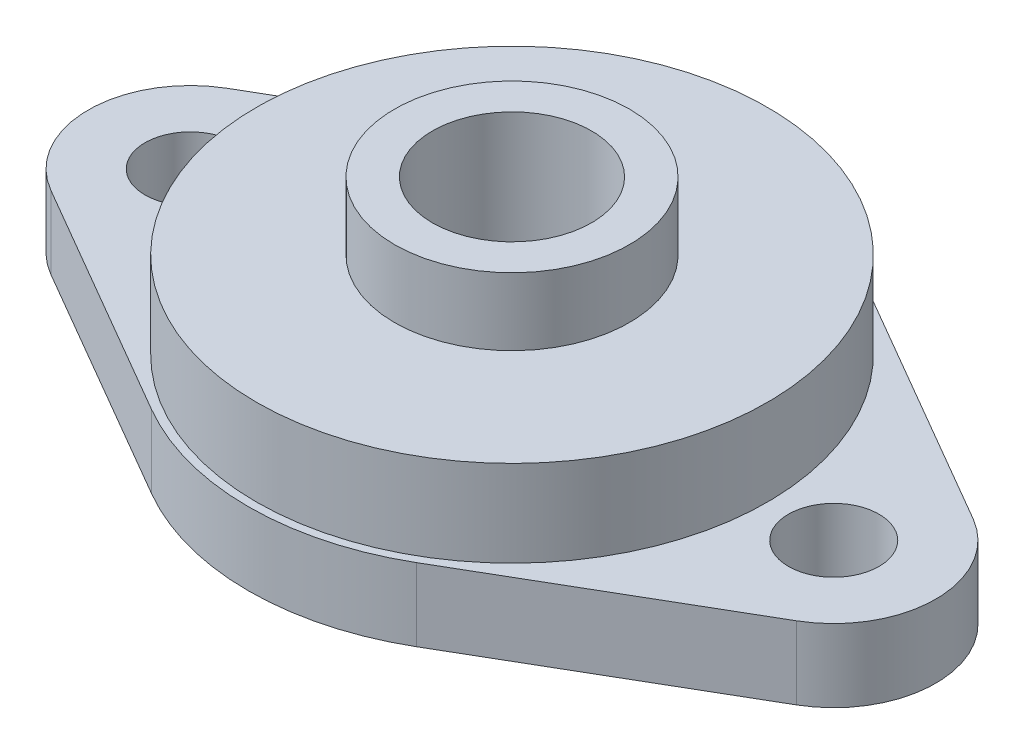
ISO-10303-21;
HEADER;
FILE_DESCRIPTION(('STEP AP214'),'2;1');
FILE_NAME('part.step','',(''),(''),'','','');
FILE_SCHEMA(('AUTOMOTIVE_DESIGN { 1 0 10303 214 1 1 1 1 }'));
ENDSEC;
DATA;
#1=APPLICATION_CONTEXT('core data for automotive mechanical design processes');
#2=APPLICATION_PROTOCOL_DEFINITION('international standard','automotive_design',2000,#1);
#3=PRODUCT_CONTEXT('',#1,'mechanical');
#4=PRODUCT('Part','Part','',(#3));
#5=PRODUCT_RELATED_PRODUCT_CATEGORY('part','',(#4));
#6=PRODUCT_DEFINITION_FORMATION('','',#4);
#7=PRODUCT_DEFINITION_CONTEXT('part definition',#1,'design');
#8=PRODUCT_DEFINITION('design','',#6,#7);
#9=PRODUCT_DEFINITION_SHAPE('','',#8);
#10=(LENGTH_UNIT() NAMED_UNIT(*) SI_UNIT(.MILLI.,.METRE.));
#11=(NAMED_UNIT(*) PLANE_ANGLE_UNIT() SI_UNIT($,.RADIAN.));
#12=(NAMED_UNIT(*) SI_UNIT($,.STERADIAN.) SOLID_ANGLE_UNIT());
#13=UNCERTAINTY_MEASURE_WITH_UNIT(LENGTH_MEASURE(1.E-05),#10,'distance_accuracy_value','');
#14=(GEOMETRIC_REPRESENTATION_CONTEXT(3) GLOBAL_UNCERTAINTY_ASSIGNED_CONTEXT((#13)) GLOBAL_UNIT_ASSIGNED_CONTEXT((#10,
#11,#12)) REPRESENTATION_CONTEXT('',''));
#15=CARTESIAN_POINT('',(0.,0.,0.));
#16=DIRECTION('',(0.,0.,1.));
#17=DIRECTION('',(1.,0.,0.));
#18=AXIS2_PLACEMENT_3D('',#15,#16,#17);
#19=CARTESIAN_POINT('',(0.,3.66,0.));
#20=DIRECTION('',(0.,1.,0.));
#21=DIRECTION('',(0.,0.,1.));
#22=AXIS2_PLACEMENT_3D('',#19,#20,#21);
#23=PLANE('',#22);
#24=CARTESIAN_POINT('',(0.,3.66,0.));
#25=DIRECTION('',(0.,1.,0.));
#26=DIRECTION('',(0.,0.,1.));
#27=AXIS2_PLACEMENT_3D('',#24,#25,#26);
#28=CIRCLE('',#27,12.835);
#29=CARTESIAN_POINT('',(0.,3.66,12.835));
#30=VERTEX_POINT('',#29);
#31=EDGE_CURVE('E299',#30,#30,#28,.F.);
#32=ORIENTED_EDGE('',*,*,#31,.T.);
#33=EDGE_LOOP('',(#32));
#34=FACE_BOUND('',#33,.T.);
#35=CARTESIAN_POINT('',(0.,3.66,0.));
#36=DIRECTION('',(0.,1.,0.));
#37=DIRECTION('',(0.,0.,1.));
#38=AXIS2_PLACEMENT_3D('',#35,#36,#37);
#39=CIRCLE('',#38,13.24);
#40=CARTESIAN_POINT('',(6.64867574257425,3.66,-11.4495725190989));
#41=VERTEX_POINT('',#40);
#42=CARTESIAN_POINT('',(-6.64867574257425,3.66,-11.4495725190989));
#43=VERTEX_POINT('',#42);
#44=EDGE_CURVE('E181',#41,#43,#39,.T.);
#45=ORIENTED_EDGE('',*,*,#44,.T.);
#46=DIRECTION('',(-0.864771338300521,0.,0.502165841584158));
#47=VECTOR('',#46,1.);
#48=CARTESIAN_POINT('',(-6.64867574257425,3.66,-11.4495725190989));
#49=LINE('',#48,#47);
#50=CARTESIAN_POINT('',(-18.7335999381188,3.66,-4.43195310879017));
#51=VERTEX_POINT('',#50);
#52=EDGE_CURVE('E89',#43,#51,#49,.T.);
#53=ORIENTED_EDGE('',*,*,#52,.T.);
#54=CARTESIAN_POINT('',(-16.16,3.66,0.));
#55=DIRECTION('',(0.,1.,0.));
#56=DIRECTION('',(0.,0.,1.));
#57=AXIS2_PLACEMENT_3D('',#54,#55,#56);
#58=CIRCLE('',#57,5.125);
#59=CARTESIAN_POINT('',(-18.7335999381188,3.66,4.43195310879017));
#60=VERTEX_POINT('',#59);
#61=EDGE_CURVE('E186',#51,#60,#58,.T.);
#62=ORIENTED_EDGE('',*,*,#61,.T.);
#63=DIRECTION('',(0.864771338300521,0.,0.502165841584158));
#64=VECTOR('',#63,1.);
#65=CARTESIAN_POINT('',(-6.64867574257425,3.66,11.4495725190989));
#66=LINE('',#65,#64);
#67=CARTESIAN_POINT('',(-6.64867574257426,3.66,11.4495725190989));
#68=VERTEX_POINT('',#67);
#69=EDGE_CURVE('E58',#60,#68,#66,.T.);
#70=ORIENTED_EDGE('',*,*,#69,.T.);
#71=CARTESIAN_POINT('',(0.,3.66,0.));
#72=DIRECTION('',(0.,1.,0.));
#73=DIRECTION('',(0.,0.,1.));
#74=AXIS2_PLACEMENT_3D('',#71,#72,#73);
#75=CIRCLE('',#74,13.24);
#76=CARTESIAN_POINT('',(6.64867574257426,3.66,11.4495725190989));
#77=VERTEX_POINT('',#76);
#78=EDGE_CURVE('E115',#68,#77,#75,.T.);
#79=ORIENTED_EDGE('',*,*,#78,.T.);
#80=DIRECTION('',(-0.864771338300521,0.,0.502165841584158));
#81=VECTOR('',#80,1.);
#82=CARTESIAN_POINT('',(6.64867574257425,3.66,11.4495725190989));
#83=LINE('',#82,#81);
#84=CARTESIAN_POINT('',(18.7335999381188,3.66,4.43195310879017));
#85=VERTEX_POINT('',#84);
#86=EDGE_CURVE('E120',#85,#77,#83,.T.);
#87=ORIENTED_EDGE('',*,*,#86,.F.);
#88=CARTESIAN_POINT('',(16.16,3.66,0.));
#89=DIRECTION('',(0.,-1.,0.));
#90=DIRECTION('',(0.,0.,1.));
#91=AXIS2_PLACEMENT_3D('',#88,#89,#90);
#92=CIRCLE('',#91,5.125);
#93=CARTESIAN_POINT('',(18.7335999381188,3.66,-4.43195310879017));
#94=VERTEX_POINT('',#93);
#95=EDGE_CURVE('E140',#94,#85,#92,.T.);
#96=ORIENTED_EDGE('',*,*,#95,.F.);
#97=DIRECTION('',(0.864771338300521,0.,0.502165841584158));
#98=VECTOR('',#97,1.);
#99=CARTESIAN_POINT('',(6.64867574257425,3.66,-11.4495725190989));
#100=LINE('',#99,#98);
#101=EDGE_CURVE('E145',#41,#94,#100,.T.);
#102=ORIENTED_EDGE('',*,*,#101,.F.);
#103=EDGE_LOOP('',(#45,#53,#62,#70,#79,#87,#96,#102));
#104=FACE_BOUND('',#103,.T.);
#105=CARTESIAN_POINT('',(-16.16,3.66,0.));
#106=DIRECTION('',(0.,1.,0.));
#107=DIRECTION('',(0.,0.,1.));
#108=AXIS2_PLACEMENT_3D('',#105,#106,#107);
#109=CIRCLE('',#108,2.275);
#110=CARTESIAN_POINT('',(-16.16,3.66,2.275));
#111=VERTEX_POINT('',#110);
#112=EDGE_CURVE('E173',#111,#111,#109,.T.);
#113=ORIENTED_EDGE('',*,*,#112,.F.);
#114=EDGE_LOOP('',(#113));
#115=FACE_BOUND('',#114,.T.);
#116=CARTESIAN_POINT('',(16.16,3.66,0.));
#117=DIRECTION('',(0.,-1.,0.));
#118=DIRECTION('',(0.,0.,1.));
#119=AXIS2_PLACEMENT_3D('',#116,#117,#118);
#120=CIRCLE('',#119,2.275);
#121=CARTESIAN_POINT('',(16.16,3.66,2.275));
#122=VERTEX_POINT('',#121);
#123=EDGE_CURVE('E161',#122,#122,#120,.T.);
#124=ORIENTED_EDGE('',*,*,#123,.T.);
#125=EDGE_LOOP('',(#124));
#126=FACE_BOUND('',#125,.T.);
#127=ADVANCED_FACE('F39',(#34,#104,#115,#126),#23,.T.);
#128=CARTESIAN_POINT('',(0.,0.,0.));
#129=DIRECTION('',(0.,1.,0.));
#130=DIRECTION('',(0.,0.,1.));
#131=AXIS2_PLACEMENT_3D('',#128,#129,#130);
#132=PLANE('',#131);
#133=CARTESIAN_POINT('',(0.,0.,0.));
#134=DIRECTION('',(0.,1.,0.));
#135=DIRECTION('',(0.,0.,1.));
#136=AXIS2_PLACEMENT_3D('',#133,#134,#135);
#137=CIRCLE('',#136,4.);
#138=CARTESIAN_POINT('',(0.,0.,4.));
#139=VERTEX_POINT('',#138);
#140=EDGE_CURVE('E282',#139,#139,#137,.T.);
#141=ORIENTED_EDGE('',*,*,#140,.T.);
#142=EDGE_LOOP('',(#141));
#143=FACE_BOUND('',#142,.T.);
#144=CARTESIAN_POINT('',(0.,0.,0.));
#145=DIRECTION('',(0.,1.,0.));
#146=DIRECTION('',(0.,0.,1.));
#147=AXIS2_PLACEMENT_3D('',#144,#145,#146);
#148=CIRCLE('',#147,13.24);
#149=CARTESIAN_POINT('',(6.64867574257425,0.,-11.4495725190989));
#150=VERTEX_POINT('',#149);
#151=CARTESIAN_POINT('',(-6.64867574257425,0.,-11.4495725190989));
#152=VERTEX_POINT('',#151);
#153=EDGE_CURVE('E177',#150,#152,#148,.T.);
#154=ORIENTED_EDGE('',*,*,#153,.F.);
#155=DIRECTION('',(0.864771338300521,0.,0.502165841584158));
#156=VECTOR('',#155,1.);
#157=CARTESIAN_POINT('',(6.64867574257425,0.,-11.4495725190989));
#158=LINE('',#157,#156);
#159=CARTESIAN_POINT('',(18.7335999381188,0.,-4.43195310879017));
#160=VERTEX_POINT('',#159);
#161=EDGE_CURVE('E141',#150,#160,#158,.T.);
#162=ORIENTED_EDGE('',*,*,#161,.T.);
#163=CARTESIAN_POINT('',(16.16,0.,0.));
#164=DIRECTION('',(0.,-1.,0.));
#165=DIRECTION('',(0.,0.,1.));
#166=AXIS2_PLACEMENT_3D('',#163,#164,#165);
#167=CIRCLE('',#166,5.125);
#168=CARTESIAN_POINT('',(18.7335999381188,0.,4.43195310879017));
#169=VERTEX_POINT('',#168);
#170=EDGE_CURVE('E148',#160,#169,#167,.T.);
#171=ORIENTED_EDGE('',*,*,#170,.T.);
#172=DIRECTION('',(-0.864771338300521,0.,0.502165841584158));
#173=VECTOR('',#172,1.);
#174=CARTESIAN_POINT('',(6.64867574257425,0.,11.4495725190989));
#175=LINE('',#174,#173);
#176=CARTESIAN_POINT('',(6.64867574257426,0.,11.4495725190989));
#177=VERTEX_POINT('',#176);
#178=EDGE_CURVE('E158',#169,#177,#175,.T.);
#179=ORIENTED_EDGE('',*,*,#178,.T.);
#180=CARTESIAN_POINT('',(0.,0.,0.));
#181=DIRECTION('',(0.,1.,0.));
#182=DIRECTION('',(0.,0.,1.));
#183=AXIS2_PLACEMENT_3D('',#180,#181,#182);
#184=CIRCLE('',#183,13.24);
#185=CARTESIAN_POINT('',(-6.64867574257426,0.,11.4495725190989));
#186=VERTEX_POINT('',#185);
#187=EDGE_CURVE('E130',#186,#177,#184,.T.);
#188=ORIENTED_EDGE('',*,*,#187,.F.);
#189=DIRECTION('',(0.864771338300521,0.,0.502165841584158));
#190=VECTOR('',#189,1.);
#191=CARTESIAN_POINT('',(-6.64867574257425,0.,11.4495725190989));
#192=LINE('',#191,#190);
#193=CARTESIAN_POINT('',(-18.7335999381188,0.,4.43195310879017));
#194=VERTEX_POINT('',#193);
#195=EDGE_CURVE('E82',#194,#186,#192,.T.);
#196=ORIENTED_EDGE('',*,*,#195,.F.);
#197=CARTESIAN_POINT('',(-16.16,0.,0.));
#198=DIRECTION('',(0.,1.,0.));
#199=DIRECTION('',(0.,0.,1.));
#200=AXIS2_PLACEMENT_3D('',#197,#198,#199);
#201=CIRCLE('',#200,5.125);
#202=CARTESIAN_POINT('',(-18.7335999381188,0.,-4.43195310879017));
#203=VERTEX_POINT('',#202);
#204=EDGE_CURVE('E76',#203,#194,#201,.T.);
#205=ORIENTED_EDGE('',*,*,#204,.F.);
#206=DIRECTION('',(-0.864771338300521,0.,0.502165841584158));
#207=VECTOR('',#206,1.);
#208=CARTESIAN_POINT('',(-6.64867574257425,0.,-11.4495725190989));
#209=LINE('',#208,#207);
#210=EDGE_CURVE('E194',#152,#203,#209,.T.);
#211=ORIENTED_EDGE('',*,*,#210,.F.);
#212=EDGE_LOOP('',(#154,#162,#171,#179,#188,#196,#205,#211));
#213=FACE_BOUND('',#212,.T.);
#214=CARTESIAN_POINT('',(-16.16,0.,0.));
#215=DIRECTION('',(0.,1.,0.));
#216=DIRECTION('',(0.,0.,1.));
#217=AXIS2_PLACEMENT_3D('',#214,#215,#216);
#218=CIRCLE('',#217,2.275);
#219=CARTESIAN_POINT('',(-16.16,0.,2.275));
#220=VERTEX_POINT('',#219);
#221=EDGE_CURVE('E135',#220,#220,#218,.T.);
#222=ORIENTED_EDGE('',*,*,#221,.T.);
#223=EDGE_LOOP('',(#222));
#224=FACE_BOUND('',#223,.T.);
#225=CARTESIAN_POINT('',(16.16,0.,0.));
#226=DIRECTION('',(0.,-1.,0.));
#227=DIRECTION('',(0.,0.,1.));
#228=AXIS2_PLACEMENT_3D('',#225,#226,#227);
#229=CIRCLE('',#228,2.275);
#230=CARTESIAN_POINT('',(16.16,0.,2.275));
#231=VERTEX_POINT('',#230);
#232=EDGE_CURVE('E151',#231,#231,#229,.T.);
#233=ORIENTED_EDGE('',*,*,#232,.F.);
#234=EDGE_LOOP('',(#233));
#235=FACE_BOUND('',#234,.T.);
#236=ADVANCED_FACE('F212',(#143,#213,#224,#235),#132,.F.);
#237=CARTESIAN_POINT('',(0.,3.66,0.));
#238=DIRECTION('',(0.,-1.,0.));
#239=DIRECTION('',(0.,0.,-1.));
#240=AXIS2_PLACEMENT_3D('',#237,#238,#239);
#241=CYLINDRICAL_SURFACE('',#240,13.24);
#242=ORIENTED_EDGE('',*,*,#153,.T.);
#243=DIRECTION('',(0.,-1.,0.));
#244=VECTOR('',#243,1.);
#245=CARTESIAN_POINT('',(-6.64867574257425,3.66,-11.4495725190989));
#246=LINE('',#245,#244);
#247=EDGE_CURVE('E11',#43,#152,#246,.T.);
#248=ORIENTED_EDGE('',*,*,#247,.F.);
#249=ORIENTED_EDGE('',*,*,#44,.F.);
#250=DIRECTION('',(0.,-1.,0.));
#251=VECTOR('',#250,1.);
#252=CARTESIAN_POINT('',(6.64867574257425,3.66,-11.4495725190989));
#253=LINE('',#252,#251);
#254=EDGE_CURVE('E157',#41,#150,#253,.T.);
#255=ORIENTED_EDGE('',*,*,#254,.T.);
#256=EDGE_LOOP('',(#242,#248,#249,#255));
#257=FACE_BOUND('',#256,.T.);
#258=ADVANCED_FACE('F41',(#257),#241,.T.);
#259=CARTESIAN_POINT('',(-6.64867574257425,3.66,-11.4495725190989));
#260=DIRECTION('',(0.502165841584158,0.,0.864771338300521));
#261=DIRECTION('',(0.864771338300521,0.,-0.502165841584158));
#262=AXIS2_PLACEMENT_3D('',#259,#260,#261);
#263=PLANE('',#262);
#264=ORIENTED_EDGE('',*,*,#210,.T.);
#265=DIRECTION('',(0.,-1.,0.));
#266=VECTOR('',#265,1.);
#267=CARTESIAN_POINT('',(-18.7335999381188,3.66,-4.43195310879017));
#268=LINE('',#267,#266);
#269=EDGE_CURVE('E50',#51,#203,#268,.T.);
#270=ORIENTED_EDGE('',*,*,#269,.F.);
#271=ORIENTED_EDGE('',*,*,#52,.F.);
#272=ORIENTED_EDGE('',*,*,#247,.T.);
#273=EDGE_LOOP('',(#264,#270,#271,#272));
#274=FACE_BOUND('',#273,.T.);
#275=ADVANCED_FACE('F233',(#274),#263,.F.);
#276=CARTESIAN_POINT('',(-16.16,3.66,0.));
#277=DIRECTION('',(0.,-1.,0.));
#278=DIRECTION('',(0.,0.,-1.));
#279=AXIS2_PLACEMENT_3D('',#276,#277,#278);
#280=CYLINDRICAL_SURFACE('',#279,5.125);
#281=ORIENTED_EDGE('',*,*,#204,.T.);
#282=DIRECTION('',(0.,-1.,0.));
#283=VECTOR('',#282,1.);
#284=CARTESIAN_POINT('',(-18.7335999381188,3.66,4.43195310879017));
#285=LINE('',#284,#283);
#286=EDGE_CURVE('E205',#60,#194,#285,.T.);
#287=ORIENTED_EDGE('',*,*,#286,.F.);
#288=ORIENTED_EDGE('',*,*,#61,.F.);
#289=ORIENTED_EDGE('',*,*,#269,.T.);
#290=EDGE_LOOP('',(#281,#287,#288,#289));
#291=FACE_BOUND('',#290,.T.);
#292=ADVANCED_FACE('F210',(#291),#280,.T.);
#293=CARTESIAN_POINT('',(-6.64867574257425,3.66,11.4495725190989));
#294=DIRECTION('',(0.502165841584158,0.,-0.864771338300521));
#295=DIRECTION('',(-0.864771338300521,0.,-0.502165841584158));
#296=AXIS2_PLACEMENT_3D('',#293,#294,#295);
#297=PLANE('',#296);
#298=ORIENTED_EDGE('',*,*,#195,.T.);
#299=DIRECTION('',(0.,-1.,0.));
#300=VECTOR('',#299,1.);
#301=CARTESIAN_POINT('',(-6.64867574257426,3.66,11.4495725190989));
#302=LINE('',#301,#300);
#303=EDGE_CURVE('E124',#68,#186,#302,.T.);
#304=ORIENTED_EDGE('',*,*,#303,.F.);
#305=ORIENTED_EDGE('',*,*,#69,.F.);
#306=ORIENTED_EDGE('',*,*,#286,.T.);
#307=EDGE_LOOP('',(#298,#304,#305,#306));
#308=FACE_BOUND('',#307,.T.);
#309=ADVANCED_FACE('F224',(#308),#297,.F.);
#310=CARTESIAN_POINT('',(0.,3.66,0.));
#311=DIRECTION('',(0.,-1.,0.));
#312=DIRECTION('',(0.,0.,-1.));
#313=AXIS2_PLACEMENT_3D('',#310,#311,#312);
#314=CYLINDRICAL_SURFACE('',#313,13.24);
#315=ORIENTED_EDGE('',*,*,#187,.T.);
#316=DIRECTION('',(0.,-1.,0.));
#317=VECTOR('',#316,1.);
#318=CARTESIAN_POINT('',(6.64867574257426,3.66,11.4495725190989));
#319=LINE('',#318,#317);
#320=EDGE_CURVE('E127',#77,#177,#319,.T.);
#321=ORIENTED_EDGE('',*,*,#320,.F.);
#322=ORIENTED_EDGE('',*,*,#78,.F.);
#323=ORIENTED_EDGE('',*,*,#303,.T.);
#324=EDGE_LOOP('',(#315,#321,#322,#323));
#325=FACE_BOUND('',#324,.T.);
#326=ADVANCED_FACE('F128',(#325),#314,.T.);
#327=CARTESIAN_POINT('',(-16.16,3.66,0.));
#328=DIRECTION('',(0.,-1.,0.));
#329=DIRECTION('',(0.,0.,-1.));
#330=AXIS2_PLACEMENT_3D('',#327,#328,#329);
#331=CYLINDRICAL_SURFACE('',#330,2.275);
#332=ORIENTED_EDGE('',*,*,#112,.T.);
#333=EDGE_LOOP('',(#332));
#334=FACE_BOUND('',#333,.T.);
#335=ORIENTED_EDGE('',*,*,#221,.F.);
#336=EDGE_LOOP('',(#335));
#337=FACE_BOUND('',#336,.T.);
#338=ADVANCED_FACE('F231',(#334,#337),#331,.F.);
#339=CARTESIAN_POINT('',(6.64867574257425,3.66,11.4495725190989));
#340=DIRECTION('',(0.502165841584158,0.,0.864771338300521));
#341=DIRECTION('',(0.864771338300521,0.,-0.502165841584158));
#342=AXIS2_PLACEMENT_3D('',#339,#340,#341);
#343=PLANE('',#342);
#344=ORIENTED_EDGE('',*,*,#178,.F.);
#345=DIRECTION('',(0.,-1.,0.));
#346=VECTOR('',#345,1.);
#347=CARTESIAN_POINT('',(18.7335999381188,3.66,4.43195310879017));
#348=LINE('',#347,#346);
#349=EDGE_CURVE('E136',#85,#169,#348,.T.);
#350=ORIENTED_EDGE('',*,*,#349,.F.);
#351=ORIENTED_EDGE('',*,*,#86,.T.);
#352=ORIENTED_EDGE('',*,*,#320,.T.);
#353=EDGE_LOOP('',(#344,#350,#351,#352));
#354=FACE_BOUND('',#353,.T.);
#355=ADVANCED_FACE('F138',(#354),#343,.T.);
#356=CARTESIAN_POINT('',(16.16,3.66,0.));
#357=DIRECTION('',(0.,-1.,0.));
#358=DIRECTION('',(0.,0.,-1.));
#359=AXIS2_PLACEMENT_3D('',#356,#357,#358);
#360=CYLINDRICAL_SURFACE('',#359,5.125);
#361=ORIENTED_EDGE('',*,*,#170,.F.);
#362=DIRECTION('',(0.,-1.,0.));
#363=VECTOR('',#362,1.);
#364=CARTESIAN_POINT('',(18.7335999381188,3.66,-4.43195310879017));
#365=LINE('',#364,#363);
#366=EDGE_CURVE('E168',#94,#160,#365,.T.);
#367=ORIENTED_EDGE('',*,*,#366,.F.);
#368=ORIENTED_EDGE('',*,*,#95,.T.);
#369=ORIENTED_EDGE('',*,*,#349,.T.);
#370=EDGE_LOOP('',(#361,#367,#368,#369));
#371=FACE_BOUND('',#370,.T.);
#372=ADVANCED_FACE('F217',(#371),#360,.T.);
#373=CARTESIAN_POINT('',(6.64867574257425,3.66,-11.4495725190989));
#374=DIRECTION('',(0.502165841584158,0.,-0.864771338300521));
#375=DIRECTION('',(-0.864771338300521,0.,-0.502165841584158));
#376=AXIS2_PLACEMENT_3D('',#373,#374,#375);
#377=PLANE('',#376);
#378=ORIENTED_EDGE('',*,*,#161,.F.);
#379=ORIENTED_EDGE('',*,*,#254,.F.);
#380=ORIENTED_EDGE('',*,*,#101,.T.);
#381=ORIENTED_EDGE('',*,*,#366,.T.);
#382=EDGE_LOOP('',(#378,#379,#380,#381));
#383=FACE_BOUND('',#382,.T.);
#384=ADVANCED_FACE('F221',(#383),#377,.T.);
#385=CARTESIAN_POINT('',(16.16,3.66,0.));
#386=DIRECTION('',(0.,-1.,0.));
#387=DIRECTION('',(0.,0.,-1.));
#388=AXIS2_PLACEMENT_3D('',#385,#386,#387);
#389=CYLINDRICAL_SURFACE('',#388,2.275);
#390=ORIENTED_EDGE('',*,*,#123,.F.);
#391=EDGE_LOOP('',(#390));
#392=FACE_BOUND('',#391,.T.);
#393=ORIENTED_EDGE('',*,*,#232,.T.);
#394=EDGE_LOOP('',(#393));
#395=FACE_BOUND('',#394,.T.);
#396=ADVANCED_FACE('F254',(#392,#395),#389,.F.);
#397=CARTESIAN_POINT('',(0.,8.,0.));
#398=DIRECTION('',(0.,-1.,0.));
#399=DIRECTION('',(0.,0.,-1.));
#400=AXIS2_PLACEMENT_3D('',#397,#398,#399);
#401=CYLINDRICAL_SURFACE('',#400,12.835);
#402=ORIENTED_EDGE('',*,*,#31,.F.);
#403=EDGE_LOOP('',(#402));
#404=FACE_BOUND('',#403,.T.);
#405=CARTESIAN_POINT('',(0.,8.,0.));
#406=DIRECTION('',(0.,1.,0.));
#407=DIRECTION('',(0.,0.,1.));
#408=AXIS2_PLACEMENT_3D('',#405,#406,#407);
#409=CIRCLE('',#408,12.835);
#410=CARTESIAN_POINT('',(0.,8.,12.835));
#411=VERTEX_POINT('',#410);
#412=EDGE_CURVE('E295',#411,#411,#409,.T.);
#413=ORIENTED_EDGE('',*,*,#412,.F.);
#414=EDGE_LOOP('',(#413));
#415=FACE_BOUND('',#414,.T.);
#416=ADVANCED_FACE('F257',(#404,#415),#401,.T.);
#417=CARTESIAN_POINT('',(0.,8.,0.));
#418=DIRECTION('',(0.,1.,0.));
#419=DIRECTION('',(0.,0.,1.));
#420=AXIS2_PLACEMENT_3D('',#417,#418,#419);
#421=PLANE('',#420);
#422=CARTESIAN_POINT('',(0.,8.,0.));
#423=DIRECTION('',(0.,1.,0.));
#424=DIRECTION('',(0.,0.,1.));
#425=AXIS2_PLACEMENT_3D('',#422,#423,#424);
#426=CIRCLE('',#425,5.9);
#427=CARTESIAN_POINT('',(0.,8.,5.9));
#428=VERTEX_POINT('',#427);
#429=EDGE_CURVE('E43',#428,#428,#426,.F.);
#430=ORIENTED_EDGE('',*,*,#429,.T.);
#431=EDGE_LOOP('',(#430));
#432=FACE_BOUND('',#431,.T.);
#433=ORIENTED_EDGE('',*,*,#412,.T.);
#434=EDGE_LOOP('',(#433));
#435=FACE_BOUND('',#434,.T.);
#436=ADVANCED_FACE('F261',(#432,#435),#421,.T.);
#437=CARTESIAN_POINT('',(0.,11.39,0.));
#438=DIRECTION('',(0.,-1.,0.));
#439=DIRECTION('',(0.,0.,-1.));
#440=AXIS2_PLACEMENT_3D('',#437,#438,#439);
#441=CYLINDRICAL_SURFACE('',#440,5.9);
#442=ORIENTED_EDGE('',*,*,#429,.F.);
#443=EDGE_LOOP('',(#442));
#444=FACE_BOUND('',#443,.T.);
#445=CARTESIAN_POINT('',(0.,11.39,0.));
#446=DIRECTION('',(0.,1.,0.));
#447=DIRECTION('',(0.,0.,1.));
#448=AXIS2_PLACEMENT_3D('',#445,#446,#447);
#449=CIRCLE('',#448,5.9);
#450=CARTESIAN_POINT('',(0.,11.39,5.9));
#451=VERTEX_POINT('',#450);
#452=EDGE_CURVE('E289',#451,#451,#449,.T.);
#453=ORIENTED_EDGE('',*,*,#452,.F.);
#454=EDGE_LOOP('',(#453));
#455=FACE_BOUND('',#454,.T.);
#456=ADVANCED_FACE('F265',(#444,#455),#441,.T.);
#457=CARTESIAN_POINT('',(0.,11.39,0.));
#458=DIRECTION('',(0.,1.,0.));
#459=DIRECTION('',(0.,0.,1.));
#460=AXIS2_PLACEMENT_3D('',#457,#458,#459);
#461=PLANE('',#460);
#462=CARTESIAN_POINT('',(0.,11.39,0.));
#463=DIRECTION('',(0.,1.,0.));
#464=DIRECTION('',(0.,0.,1.));
#465=AXIS2_PLACEMENT_3D('',#462,#463,#464);
#466=CIRCLE('',#465,4.);
#467=CARTESIAN_POINT('',(0.,11.39,4.));
#468=VERTEX_POINT('',#467);
#469=EDGE_CURVE('E285',#468,#468,#466,.T.);
#470=ORIENTED_EDGE('',*,*,#469,.F.);
#471=EDGE_LOOP('',(#470));
#472=FACE_BOUND('',#471,.T.);
#473=ORIENTED_EDGE('',*,*,#452,.T.);
#474=EDGE_LOOP('',(#473));
#475=FACE_BOUND('',#474,.T.);
#476=ADVANCED_FACE('F269',(#472,#475),#461,.T.);
#477=CARTESIAN_POINT('',(0.,0.,0.));
#478=DIRECTION('',(0.,1.,0.));
#479=DIRECTION('',(0.,0.,1.));
#480=AXIS2_PLACEMENT_3D('',#477,#478,#479);
#481=CYLINDRICAL_SURFACE('',#480,4.);
#482=ORIENTED_EDGE('',*,*,#140,.F.);
#483=EDGE_LOOP('',(#482));
#484=FACE_BOUND('',#483,.T.);
#485=ORIENTED_EDGE('',*,*,#469,.T.);
#486=EDGE_LOOP('',(#485));
#487=FACE_BOUND('',#486,.T.);
#488=ADVANCED_FACE('F273',(#484,#487),#481,.F.);
#489=CLOSED_SHELL('',(#127,#236,#258,#275,#292,#309,#326,#338,#355,#372,#384,#396,#416,#436,
#456,#476,#488));
#490=MANIFOLD_SOLID_BREP('B2',#489);
#491=ADVANCED_BREP_SHAPE_REPRESENTATION('',(#18,#490),#14);
#492=SHAPE_DEFINITION_REPRESENTATION(#9,#491);
ENDSEC;
END-ISO-10303-21;
